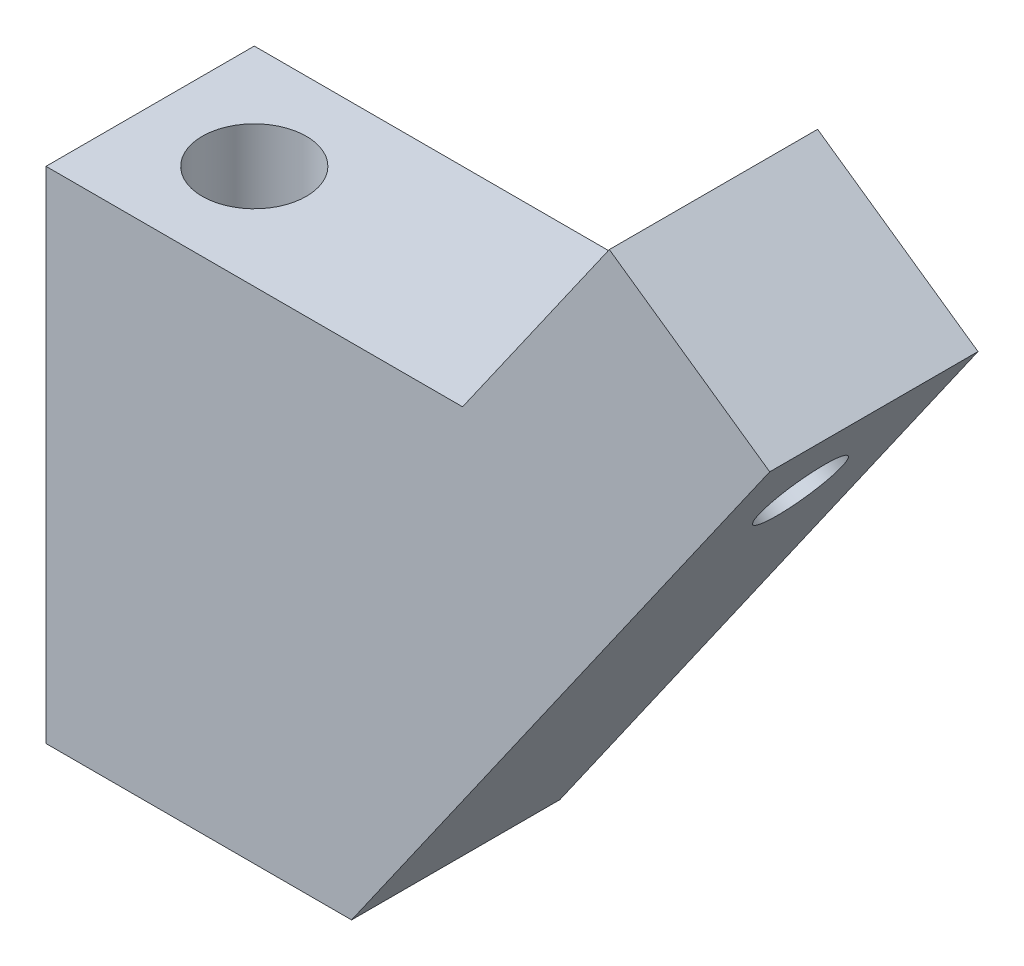
ISO-10303-21;
HEADER;
FILE_DESCRIPTION(('STEP AP214'),'2;1');
FILE_NAME('part.step','',(''),(''),'','','');
FILE_SCHEMA(('AUTOMOTIVE_DESIGN { 1 0 10303 214 1 1 1 1 }'));
ENDSEC;
DATA;
#1=APPLICATION_CONTEXT('core data for automotive mechanical design processes');
#2=APPLICATION_PROTOCOL_DEFINITION('international standard','automotive_design',2000,#1);
#3=PRODUCT_CONTEXT('',#1,'mechanical');
#4=PRODUCT('Part','Part','',(#3));
#5=PRODUCT_RELATED_PRODUCT_CATEGORY('part','',(#4));
#6=PRODUCT_DEFINITION_FORMATION('','',#4);
#7=PRODUCT_DEFINITION_CONTEXT('part definition',#1,'design');
#8=PRODUCT_DEFINITION('design','',#6,#7);
#9=PRODUCT_DEFINITION_SHAPE('','',#8);
#10=(LENGTH_UNIT() NAMED_UNIT(*) SI_UNIT(.MILLI.,.METRE.));
#11=(NAMED_UNIT(*) PLANE_ANGLE_UNIT() SI_UNIT($,.RADIAN.));
#12=(NAMED_UNIT(*) SI_UNIT($,.STERADIAN.) SOLID_ANGLE_UNIT());
#13=UNCERTAINTY_MEASURE_WITH_UNIT(LENGTH_MEASURE(1.E-05),#10,'distance_accuracy_value','');
#14=(GEOMETRIC_REPRESENTATION_CONTEXT(3) GLOBAL_UNCERTAINTY_ASSIGNED_CONTEXT((#13)) GLOBAL_UNIT_ASSIGNED_CONTEXT((#10,
#11,#12)) REPRESENTATION_CONTEXT('',''));
#15=CARTESIAN_POINT('',(0.,0.,0.));
#16=DIRECTION('',(0.,0.,1.));
#17=DIRECTION('',(1.,0.,0.));
#18=AXIS2_PLACEMENT_3D('',#15,#16,#17);
#19=CARTESIAN_POINT('',(0.,30.48,12.7));
#20=DIRECTION('',(1.,0.,0.));
#21=DIRECTION('',(0.,0.,-1.));
#22=AXIS2_PLACEMENT_3D('',#19,#20,#21);
#23=PLANE('',#22);
#24=DIRECTION('',(0.,-1.,0.));
#25=VECTOR('',#24,1.);
#26=CARTESIAN_POINT('',(0.,30.48,0.));
#27=LINE('',#26,#25);
#28=CARTESIAN_POINT('',(0.,30.48,0.));
#29=VERTEX_POINT('',#28);
#30=CARTESIAN_POINT('',(0.,0.,0.));
#31=VERTEX_POINT('',#30);
#32=EDGE_CURVE('E116',#29,#31,#27,.T.);
#33=ORIENTED_EDGE('',*,*,#32,.T.);
#34=DIRECTION('',(0.,0.,-1.));
#35=VECTOR('',#34,1.);
#36=CARTESIAN_POINT('',(0.,0.,12.7));
#37=LINE('',#36,#35);
#38=CARTESIAN_POINT('',(0.,0.,12.7));
#39=VERTEX_POINT('',#38);
#40=EDGE_CURVE('E11',#39,#31,#37,.T.);
#41=ORIENTED_EDGE('',*,*,#40,.F.);
#42=DIRECTION('',(0.,-1.,0.));
#43=VECTOR('',#42,1.);
#44=CARTESIAN_POINT('',(0.,30.48,12.7));
#45=LINE('',#44,#43);
#46=CARTESIAN_POINT('',(0.,30.48,12.7));
#47=VERTEX_POINT('',#46);
#48=EDGE_CURVE('E131',#47,#39,#45,.T.);
#49=ORIENTED_EDGE('',*,*,#48,.F.);
#50=DIRECTION('',(0.,0.,-1.));
#51=VECTOR('',#50,1.);
#52=CARTESIAN_POINT('',(0.,30.48,12.7));
#53=LINE('',#52,#51);
#54=EDGE_CURVE('E48',#47,#29,#53,.T.);
#55=ORIENTED_EDGE('',*,*,#54,.T.);
#56=EDGE_LOOP('',(#33,#41,#49,#55));
#57=FACE_BOUND('',#56,.T.);
#58=ADVANCED_FACE('F32',(#57),#23,.F.);
#59=CARTESIAN_POINT('',(0.,0.,12.7));
#60=DIRECTION('',(0.,1.,0.));
#61=DIRECTION('',(-1.,0.,0.));
#62=AXIS2_PLACEMENT_3D('',#59,#60,#61);
#63=PLANE('',#62);
#64=CARTESIAN_POINT('',(6.35,0.,6.35));
#65=DIRECTION('',(0.,1.,0.));
#66=DIRECTION('',(-1.,0.,0.));
#67=AXIS2_PLACEMENT_3D('',#64,#65,#66);
#68=CIRCLE('',#67,3.175);
#69=CARTESIAN_POINT('',(6.35,0.,9.525));
#70=VERTEX_POINT('',#69);
#71=EDGE_CURVE('E167',#70,#70,#68,.F.);
#72=ORIENTED_EDGE('',*,*,#71,.F.);
#73=EDGE_LOOP('',(#72));
#74=FACE_BOUND('',#73,.T.);
#75=DIRECTION('',(1.,0.,0.));
#76=VECTOR('',#75,1.);
#77=CARTESIAN_POINT('',(0.,0.,0.));
#78=LINE('',#77,#76);
#79=CARTESIAN_POINT('',(18.6312812760022,0.,0.));
#80=VERTEX_POINT('',#79);
#81=EDGE_CURVE('E118',#31,#80,#78,.T.);
#82=ORIENTED_EDGE('',*,*,#81,.T.);
#83=DIRECTION('',(0.,0.,-1.));
#84=VECTOR('',#83,1.);
#85=CARTESIAN_POINT('',(18.6312812760022,0.,12.7));
#86=LINE('',#85,#84);
#87=CARTESIAN_POINT('',(18.6312812760022,0.,12.7));
#88=VERTEX_POINT('',#87);
#89=EDGE_CURVE('E40',#88,#80,#86,.T.);
#90=ORIENTED_EDGE('',*,*,#89,.F.);
#91=DIRECTION('',(1.,0.,0.));
#92=VECTOR('',#91,1.);
#93=CARTESIAN_POINT('',(0.,0.,12.7));
#94=LINE('',#93,#92);
#95=EDGE_CURVE('E80',#39,#88,#94,.T.);
#96=ORIENTED_EDGE('',*,*,#95,.F.);
#97=ORIENTED_EDGE('',*,*,#40,.T.);
#98=EDGE_LOOP('',(#82,#90,#96,#97));
#99=FACE_BOUND('',#98,.T.);
#100=ADVANCED_FACE('F137',(#74,#99),#63,.F.);
#101=CARTESIAN_POINT('',(44.1267538718063,36.4113083686456,12.7));
#102=DIRECTION('',(0.819152044288989,-0.57357643635105,0.));
#103=DIRECTION('',(0.57357643635105,0.819152044288989,0.));
#104=AXIS2_PLACEMENT_3D('',#101,#102,#103);
#105=PLANE('',#104);
#106=CARTESIAN_POINT('',(39.6528954882642,30.0219764357434,6.35));
#107=DIRECTION('',(0.819152044288989,-0.57357643635105,0.));
#108=DIRECTION('',(0.57357643635105,0.819152044288989,0.));
#109=AXIS2_PLACEMENT_3D('',#106,#107,#108);
#110=CIRCLE('',#109,2.54);
#111=CARTESIAN_POINT('',(41.1097796365958,32.1026226282374,6.35));
#112=VERTEX_POINT('',#111);
#113=EDGE_CURVE('E119',#112,#112,#110,.F.);
#114=ORIENTED_EDGE('',*,*,#113,.T.);
#115=EDGE_LOOP('',(#114));
#116=FACE_BOUND('',#115,.T.);
#117=DIRECTION('',(-0.57357643635105,-0.819152044288989,0.));
#118=VECTOR('',#117,1.);
#119=CARTESIAN_POINT('',(44.1267538718063,36.4113083686456,0.));
#120=LINE('',#119,#118);
#121=CARTESIAN_POINT('',(44.1267538718063,36.4113083686456,0.));
#122=VERTEX_POINT('',#121);
#123=EDGE_CURVE('E122',#122,#80,#120,.T.);
#124=ORIENTED_EDGE('',*,*,#123,.F.);
#125=DIRECTION('',(0.,0.,-1.));
#126=VECTOR('',#125,1.);
#127=CARTESIAN_POINT('',(44.1267538718063,36.4113083686456,12.7));
#128=LINE('',#127,#126);
#129=CARTESIAN_POINT('',(44.1267538718063,36.4113083686456,12.7));
#130=VERTEX_POINT('',#129);
#131=EDGE_CURVE('E99',#130,#122,#128,.T.);
#132=ORIENTED_EDGE('',*,*,#131,.F.);
#133=DIRECTION('',(-0.57357643635105,-0.819152044288989,0.));
#134=VECTOR('',#133,1.);
#135=CARTESIAN_POINT('',(44.1267538718063,36.4113083686456,12.7));
#136=LINE('',#135,#134);
#137=EDGE_CURVE('E108',#130,#88,#136,.T.);
#138=ORIENTED_EDGE('',*,*,#137,.T.);
#139=ORIENTED_EDGE('',*,*,#89,.T.);
#140=EDGE_LOOP('',(#124,#132,#138,#139));
#141=FACE_BOUND('',#140,.T.);
#142=ADVANCED_FACE('F136',(#116,#141),#105,.T.);
#143=CARTESIAN_POINT('',(34.3477167670844,43.2586638658044,12.7));
#144=DIRECTION('',(0.57357643635105,0.819152044288989,0.));
#145=DIRECTION('',(-0.819152044288989,0.57357643635105,0.));
#146=AXIS2_PLACEMENT_3D('',#143,#144,#145);
#147=PLANE('',#146);
#148=DIRECTION('',(0.819152044288989,-0.57357643635105,0.));
#149=VECTOR('',#148,1.);
#150=CARTESIAN_POINT('',(34.3477167670844,43.2586638658044,0.));
#151=LINE('',#150,#149);
#152=CARTESIAN_POINT('',(34.3477167670844,43.2586638658044,0.));
#153=VERTEX_POINT('',#152);
#154=EDGE_CURVE('E95',#153,#122,#151,.T.);
#155=ORIENTED_EDGE('',*,*,#154,.F.);
#156=DIRECTION('',(0.,0.,-1.));
#157=VECTOR('',#156,1.);
#158=CARTESIAN_POINT('',(34.3477167670844,43.2586638658044,12.7));
#159=LINE('',#158,#157);
#160=CARTESIAN_POINT('',(34.3477167670844,43.2586638658044,12.7));
#161=VERTEX_POINT('',#160);
#162=EDGE_CURVE('E90',#161,#153,#159,.T.);
#163=ORIENTED_EDGE('',*,*,#162,.F.);
#164=DIRECTION('',(0.819152044288989,-0.57357643635105,0.));
#165=VECTOR('',#164,1.);
#166=CARTESIAN_POINT('',(34.3477167670844,43.2586638658044,12.7));
#167=LINE('',#166,#165);
#168=EDGE_CURVE('E93',#161,#130,#167,.T.);
#169=ORIENTED_EDGE('',*,*,#168,.T.);
#170=ORIENTED_EDGE('',*,*,#131,.T.);
#171=EDGE_LOOP('',(#155,#163,#169,#170));
#172=FACE_BOUND('',#171,.T.);
#173=ADVANCED_FACE('F92',(#172),#147,.T.);
#174=CARTESIAN_POINT('',(25.4,30.48,12.7));
#175=DIRECTION('',(-0.819152044288989,0.57357643635105,0.));
#176=DIRECTION('',(-0.57357643635105,-0.819152044288989,0.));
#177=AXIS2_PLACEMENT_3D('',#174,#175,#176);
#178=PLANE('',#177);
#179=CARTESIAN_POINT('',(29.8738583835422,36.8693319329022,6.35));
#180=DIRECTION('',(-0.819152044288989,0.57357643635105,0.));
#181=DIRECTION('',(-0.57357643635105,-0.819152044288989,0.));
#182=AXIS2_PLACEMENT_3D('',#179,#180,#181);
#183=CIRCLE('',#182,2.54);
#184=CARTESIAN_POINT('',(28.4169742352105,34.7886857404082,6.35));
#185=VERTEX_POINT('',#184);
#186=EDGE_CURVE('E164',#185,#185,#183,.T.);
#187=ORIENTED_EDGE('',*,*,#186,.F.);
#188=EDGE_LOOP('',(#187));
#189=FACE_BOUND('',#188,.T.);
#190=DIRECTION('',(0.57357643635105,0.819152044288989,0.));
#191=VECTOR('',#190,1.);
#192=CARTESIAN_POINT('',(25.4,30.48,0.));
#193=LINE('',#192,#191);
#194=CARTESIAN_POINT('',(25.4,30.48,0.));
#195=VERTEX_POINT('',#194);
#196=EDGE_CURVE('E126',#195,#153,#193,.T.);
#197=ORIENTED_EDGE('',*,*,#196,.F.);
#198=DIRECTION('',(0.,0.,-1.));
#199=VECTOR('',#198,1.);
#200=CARTESIAN_POINT('',(25.4,30.48,12.7));
#201=LINE('',#200,#199);
#202=CARTESIAN_POINT('',(25.4,30.48,12.7));
#203=VERTEX_POINT('',#202);
#204=EDGE_CURVE('E68',#203,#195,#201,.T.);
#205=ORIENTED_EDGE('',*,*,#204,.F.);
#206=DIRECTION('',(0.57357643635105,0.819152044288989,0.));
#207=VECTOR('',#206,1.);
#208=CARTESIAN_POINT('',(25.4,30.48,12.7));
#209=LINE('',#208,#207);
#210=EDGE_CURVE('E106',#203,#161,#209,.T.);
#211=ORIENTED_EDGE('',*,*,#210,.T.);
#212=ORIENTED_EDGE('',*,*,#162,.T.);
#213=EDGE_LOOP('',(#197,#205,#211,#212));
#214=FACE_BOUND('',#213,.T.);
#215=ADVANCED_FACE('F110',(#189,#214),#178,.T.);
#216=CARTESIAN_POINT('',(0.,30.48,12.7));
#217=DIRECTION('',(0.,1.,0.));
#218=DIRECTION('',(-1.,0.,0.));
#219=AXIS2_PLACEMENT_3D('',#216,#217,#218);
#220=PLANE('',#219);
#221=CARTESIAN_POINT('',(6.35,30.48,6.35));
#222=DIRECTION('',(0.,1.,0.));
#223=DIRECTION('',(0.,0.,1.));
#224=AXIS2_PLACEMENT_3D('',#221,#222,#223);
#225=CIRCLE('',#224,3.175);
#226=CARTESIAN_POINT('',(6.35,30.48,9.525));
#227=VERTEX_POINT('',#226);
#228=EDGE_CURVE('E170',#227,#227,#225,.T.);
#229=ORIENTED_EDGE('',*,*,#228,.F.);
#230=EDGE_LOOP('',(#229));
#231=FACE_BOUND('',#230,.T.);
#232=DIRECTION('',(1.,0.,0.));
#233=VECTOR('',#232,1.);
#234=CARTESIAN_POINT('',(0.,30.48,0.));
#235=LINE('',#234,#233);
#236=EDGE_CURVE('E128',#29,#195,#235,.T.);
#237=ORIENTED_EDGE('',*,*,#236,.F.);
#238=ORIENTED_EDGE('',*,*,#54,.F.);
#239=DIRECTION('',(1.,0.,0.));
#240=VECTOR('',#239,1.);
#241=CARTESIAN_POINT('',(0.,30.48,12.7));
#242=LINE('',#241,#240);
#243=EDGE_CURVE('E111',#47,#203,#242,.T.);
#244=ORIENTED_EDGE('',*,*,#243,.T.);
#245=ORIENTED_EDGE('',*,*,#204,.T.);
#246=EDGE_LOOP('',(#237,#238,#244,#245));
#247=FACE_BOUND('',#246,.T.);
#248=ADVANCED_FACE('F141',(#231,#247),#220,.T.);
#249=CARTESIAN_POINT('',(0.,0.,12.7));
#250=DIRECTION('',(0.,0.,1.));
#251=DIRECTION('',(1.,0.,0.));
#252=AXIS2_PLACEMENT_3D('',#249,#250,#251);
#253=PLANE('',#252);
#254=ORIENTED_EDGE('',*,*,#48,.T.);
#255=ORIENTED_EDGE('',*,*,#95,.T.);
#256=ORIENTED_EDGE('',*,*,#137,.F.);
#257=ORIENTED_EDGE('',*,*,#168,.F.);
#258=ORIENTED_EDGE('',*,*,#210,.F.);
#259=ORIENTED_EDGE('',*,*,#243,.F.);
#260=EDGE_LOOP('',(#254,#255,#256,#257,#258,#259));
#261=FACE_BOUND('',#260,.T.);
#262=ADVANCED_FACE('F104',(#261),#253,.T.);
#263=CARTESIAN_POINT('',(0.,0.,0.));
#264=DIRECTION('',(0.,0.,1.));
#265=DIRECTION('',(1.,0.,0.));
#266=AXIS2_PLACEMENT_3D('',#263,#264,#265);
#267=PLANE('',#266);
#268=ORIENTED_EDGE('',*,*,#32,.F.);
#269=ORIENTED_EDGE('',*,*,#236,.T.);
#270=ORIENTED_EDGE('',*,*,#196,.T.);
#271=ORIENTED_EDGE('',*,*,#154,.T.);
#272=ORIENTED_EDGE('',*,*,#123,.T.);
#273=ORIENTED_EDGE('',*,*,#81,.F.);
#274=EDGE_LOOP('',(#268,#269,#270,#271,#272,#273));
#275=FACE_BOUND('',#274,.T.);
#276=ADVANCED_FACE('F140',(#275),#267,.F.);
#277=CARTESIAN_POINT('',(45.5378516161142,25.9012857929893,6.35));
#278=DIRECTION('',(-0.819152044288989,0.57357643635105,0.));
#279=DIRECTION('',(-0.57357643635105,-0.819152044288989,0.));
#280=AXIS2_PLACEMENT_3D('',#277,#278,#279);
#281=CYLINDRICAL_SURFACE('',#280,2.54);
#282=ORIENTED_EDGE('',*,*,#186,.T.);
#283=EDGE_LOOP('',(#282));
#284=FACE_BOUND('',#283,.T.);
#285=ORIENTED_EDGE('',*,*,#113,.F.);
#286=EDGE_LOOP('',(#285));
#287=FACE_BOUND('',#286,.T.);
#288=ADVANCED_FACE('F175',(#284,#287),#281,.F.);
#289=CARTESIAN_POINT('',(6.35,-8.98025612106916,6.35));
#290=DIRECTION('',(0.,1.,0.));
#291=DIRECTION('',(0.,0.,1.));
#292=AXIS2_PLACEMENT_3D('',#289,#290,#291);
#293=CYLINDRICAL_SURFACE('',#292,3.175);
#294=CARTESIAN_POINT('',(6.35,0.,9.525));
#295=CARTESIAN_POINT('',(6.35,0.317499999999998,9.525));
#296=CARTESIAN_POINT('',(6.35,0.634999999999998,9.525));
#297=CARTESIAN_POINT('',(6.35,1.27,9.525));
#298=CARTESIAN_POINT('',(6.35,1.5875,9.525));
#299=CARTESIAN_POINT('',(6.35,2.2225,9.525));
#300=CARTESIAN_POINT('',(6.35,2.54,9.525));
#301=CARTESIAN_POINT('',(6.35,3.175,9.525));
#302=CARTESIAN_POINT('',(6.35,3.4925,9.525));
#303=CARTESIAN_POINT('',(6.35,4.1275,9.525));
#304=CARTESIAN_POINT('',(6.35,4.445,9.525));
#305=CARTESIAN_POINT('',(6.35,5.08,9.525));
#306=CARTESIAN_POINT('',(6.35,5.3975,9.525));
#307=CARTESIAN_POINT('',(6.35,6.0325,9.525));
#308=CARTESIAN_POINT('',(6.35,6.35,9.525));
#309=CARTESIAN_POINT('',(6.35,6.985,9.525));
#310=CARTESIAN_POINT('',(6.35,7.30249999999999,9.525));
#311=CARTESIAN_POINT('',(6.35,7.93749999999999,9.525));
#312=CARTESIAN_POINT('',(6.35,8.25499999999999,9.525));
#313=CARTESIAN_POINT('',(6.35,8.88999999999999,9.525));
#314=CARTESIAN_POINT('',(6.35,9.2075,9.525));
#315=CARTESIAN_POINT('',(6.35,9.8425,9.525));
#316=CARTESIAN_POINT('',(6.35,10.16,9.525));
#317=CARTESIAN_POINT('',(6.35,10.795,9.525));
#318=CARTESIAN_POINT('',(6.35,11.1125,9.525));
#319=CARTESIAN_POINT('',(6.35,11.7475,9.525));
#320=CARTESIAN_POINT('',(6.35,12.065,9.525));
#321=CARTESIAN_POINT('',(6.35,12.7,9.525));
#322=CARTESIAN_POINT('',(6.35,13.0175,9.525));
#323=CARTESIAN_POINT('',(6.35,13.6525,9.525));
#324=CARTESIAN_POINT('',(6.35,13.97,9.525));
#325=CARTESIAN_POINT('',(6.35,14.605,9.525));
#326=CARTESIAN_POINT('',(6.35,14.9225,9.525));
#327=CARTESIAN_POINT('',(6.35,15.5575,9.525));
#328=CARTESIAN_POINT('',(6.35,15.875,9.525));
#329=CARTESIAN_POINT('',(6.35,16.51,9.525));
#330=CARTESIAN_POINT('',(6.35,16.8275,9.525));
#331=CARTESIAN_POINT('',(6.35,17.4625,9.525));
#332=CARTESIAN_POINT('',(6.35,17.78,9.525));
#333=CARTESIAN_POINT('',(6.35,18.415,9.525));
#334=CARTESIAN_POINT('',(6.35,18.7325,9.525));
#335=CARTESIAN_POINT('',(6.35,19.3675,9.525));
#336=CARTESIAN_POINT('',(6.35,19.685,9.525));
#337=CARTESIAN_POINT('',(6.35,20.32,9.525));
#338=CARTESIAN_POINT('',(6.35,20.6375,9.525));
#339=CARTESIAN_POINT('',(6.35,21.2725,9.525));
#340=CARTESIAN_POINT('',(6.35,21.59,9.525));
#341=CARTESIAN_POINT('',(6.35,22.225,9.525));
#342=CARTESIAN_POINT('',(6.35,22.5425,9.525));
#343=CARTESIAN_POINT('',(6.35,23.1775,9.525));
#344=CARTESIAN_POINT('',(6.35,23.495,9.525));
#345=CARTESIAN_POINT('',(6.35,24.13,9.525));
#346=CARTESIAN_POINT('',(6.35,24.4475,9.525));
#347=CARTESIAN_POINT('',(6.35,25.0825,9.525));
#348=CARTESIAN_POINT('',(6.35,25.4,9.525));
#349=CARTESIAN_POINT('',(6.35,26.035,9.525));
#350=CARTESIAN_POINT('',(6.35,26.3525,9.525));
#351=CARTESIAN_POINT('',(6.35,26.9875,9.525));
#352=CARTESIAN_POINT('',(6.35,27.305,9.525));
#353=CARTESIAN_POINT('',(6.35,27.94,9.525));
#354=CARTESIAN_POINT('',(6.35,28.2575,9.525));
#355=CARTESIAN_POINT('',(6.35,28.8925,9.525));
#356=CARTESIAN_POINT('',(6.35,29.21,9.525));
#357=CARTESIAN_POINT('',(6.35,29.845,9.525));
#358=CARTESIAN_POINT('',(6.35,30.1625,9.525));
#359=CARTESIAN_POINT('',(6.35,30.48,9.525));
#360=B_SPLINE_CURVE_WITH_KNOTS('',3,(#294,#295,#296,#297,#298,#299,#300,#301,#302,#303,#304,
#305,#306,#307,#308,#309,#310,#311,#312,#313,#314,#315,#316,#317,#318,#319,#320,#321,#322,#323,
#324,#325,#326,#327,#328,#329,#330,#331,#332,#333,#334,#335,#336,#337,#338,#339,#340,#341,#342,
#343,#344,#345,#346,#347,#348,#349,#350,#351,#352,#353,#354,#355,#356,#357,#358,#359),
.UNSPECIFIED.,.F.,.F.,(4,2,2,2,2,2,2,2,2,2,2,2,2,2,2,2,2,2,2,2,2,2,2,2,2,2,2,2,2,2,2,2,4),(0.,
0.9525,1.905,2.8575,3.81,4.7625,5.715,6.6675,7.62,8.57249999999999,9.525,10.4775,11.43,12.3825,
13.335,14.2875,15.24,16.1925,17.145,18.0975,19.05,20.0025,20.955,21.9075,22.86,23.8125,24.765,
25.7175,26.67,27.6225,28.575,29.5275,30.48),.UNSPECIFIED.);
#361=EDGE_CURVE('BSEAM173',#70,#227,#360,.T.);
#362=ORIENTED_EDGE('',*,*,#71,.T.);
#363=ORIENTED_EDGE('',*,*,#228,.T.);
#364=ORIENTED_EDGE('',*,*,#361,.T.);
#365=ORIENTED_EDGE('',*,*,#361,.F.);
#366=EDGE_LOOP('',(#362,#364,#363,#365));
#367=FACE_BOUND('',#366,.T.);
#368=ADVANCED_FACE('F173',(#367),#293,.F.);
#369=CLOSED_SHELL('',(#58,#100,#142,#173,#215,#248,#262,#276,#288,#368));
#370=MANIFOLD_SOLID_BREP('B2',#369);
#371=ADVANCED_BREP_SHAPE_REPRESENTATION('',(#18,#370),#14);
#372=SHAPE_DEFINITION_REPRESENTATION(#9,#371);
ENDSEC;
END-ISO-10303-21;
